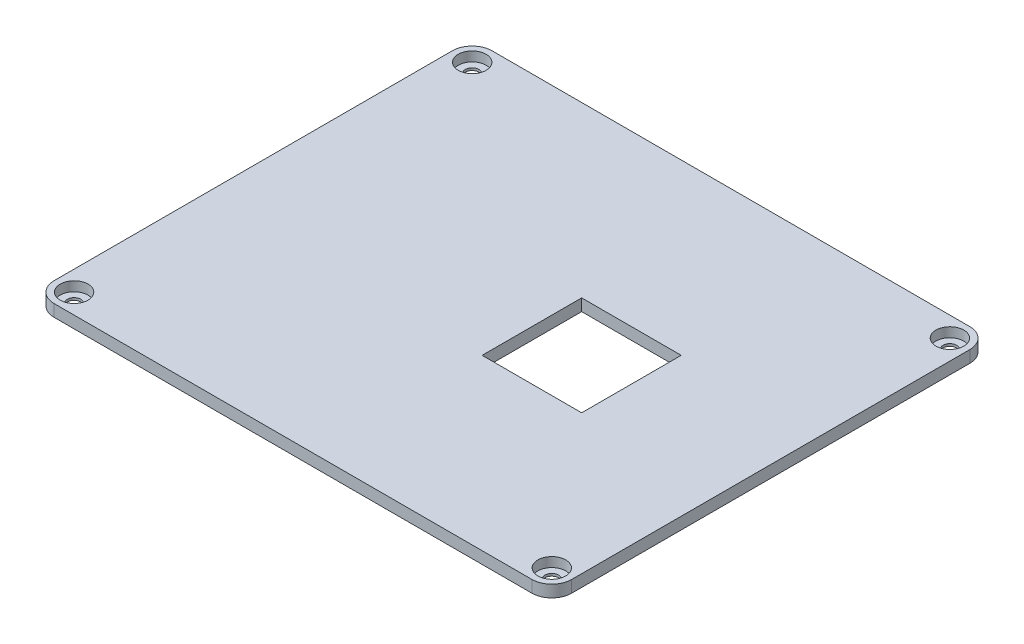
ISO-10303-21;
HEADER;
FILE_DESCRIPTION(('STEP AP214'),'2;1');
FILE_NAME('part.step','',(''),(''),'','','');
FILE_SCHEMA(('AUTOMOTIVE_DESIGN { 1 0 10303 214 1 1 1 1 }'));
ENDSEC;
DATA;
#1=APPLICATION_CONTEXT('core data for automotive mechanical design processes');
#2=APPLICATION_PROTOCOL_DEFINITION('international standard','automotive_design',2000,#1);
#3=PRODUCT_CONTEXT('',#1,'mechanical');
#4=PRODUCT('Part','Part','',(#3));
#5=PRODUCT_RELATED_PRODUCT_CATEGORY('part','',(#4));
#6=PRODUCT_DEFINITION_FORMATION('','',#4);
#7=PRODUCT_DEFINITION_CONTEXT('part definition',#1,'design');
#8=PRODUCT_DEFINITION('design','',#6,#7);
#9=PRODUCT_DEFINITION_SHAPE('','',#8);
#10=(LENGTH_UNIT() NAMED_UNIT(*) SI_UNIT(.MILLI.,.METRE.));
#11=(NAMED_UNIT(*) PLANE_ANGLE_UNIT() SI_UNIT($,.RADIAN.));
#12=(NAMED_UNIT(*) SI_UNIT($,.STERADIAN.) SOLID_ANGLE_UNIT());
#13=UNCERTAINTY_MEASURE_WITH_UNIT(LENGTH_MEASURE(1.E-05),#10,'distance_accuracy_value','');
#14=(GEOMETRIC_REPRESENTATION_CONTEXT(3) GLOBAL_UNCERTAINTY_ASSIGNED_CONTEXT((#13)) GLOBAL_UNIT_ASSIGNED_CONTEXT((#10,
#11,#12)) REPRESENTATION_CONTEXT('',''));
#15=CARTESIAN_POINT('',(0.,0.,0.));
#16=DIRECTION('',(0.,0.,1.));
#17=DIRECTION('',(1.,0.,0.));
#18=AXIS2_PLACEMENT_3D('',#15,#16,#17);
#19=CARTESIAN_POINT('',(0.,3.,0.));
#20=DIRECTION('',(1.,0.,0.));
#21=DIRECTION('',(0.,0.,-1.));
#22=AXIS2_PLACEMENT_3D('',#19,#20,#21);
#23=PLANE('',#22);
#24=DIRECTION('',(0.,0.,1.));
#25=VECTOR('',#24,1.);
#26=CARTESIAN_POINT('',(0.,3.,0.));
#27=LINE('',#26,#25);
#28=CARTESIAN_POINT('',(0.,3.,-105.));
#29=VERTEX_POINT('',#28);
#30=CARTESIAN_POINT('',(0.,3.,-5.));
#31=VERTEX_POINT('',#30);
#32=EDGE_CURVE('E197',#29,#31,#27,.T.);
#33=ORIENTED_EDGE('',*,*,#32,.F.);
#34=DIRECTION('',(0.,-1.,0.));
#35=VECTOR('',#34,1.);
#36=CARTESIAN_POINT('',(0.,3.,-105.));
#37=LINE('',#36,#35);
#38=CARTESIAN_POINT('',(0.,0.,-105.));
#39=VERTEX_POINT('',#38);
#40=EDGE_CURVE('E235',#29,#39,#37,.T.);
#41=ORIENTED_EDGE('',*,*,#40,.T.);
#42=DIRECTION('',(0.,0.,1.));
#43=VECTOR('',#42,1.);
#44=CARTESIAN_POINT('',(0.,0.,0.));
#45=LINE('',#44,#43);
#46=CARTESIAN_POINT('',(0.,0.,-5.));
#47=VERTEX_POINT('',#46);
#48=EDGE_CURVE('E209',#39,#47,#45,.T.);
#49=ORIENTED_EDGE('',*,*,#48,.T.);
#50=DIRECTION('',(0.,-1.,0.));
#51=VECTOR('',#50,1.);
#52=CARTESIAN_POINT('',(0.,3.,-5.));
#53=LINE('',#52,#51);
#54=EDGE_CURVE('E233',#47,#31,#53,.F.);
#55=ORIENTED_EDGE('',*,*,#54,.T.);
#56=EDGE_LOOP('',(#33,#41,#49,#55));
#57=FACE_BOUND('',#56,.T.);
#58=ADVANCED_FACE('F33',(#57),#23,.F.);
#59=CARTESIAN_POINT('',(0.,3.,0.));
#60=DIRECTION('',(0.,0.,-1.));
#61=DIRECTION('',(-1.,0.,0.));
#62=AXIS2_PLACEMENT_3D('',#59,#60,#61);
#63=PLANE('',#62);
#64=DIRECTION('',(1.,0.,0.));
#65=VECTOR('',#64,1.);
#66=CARTESIAN_POINT('',(0.,3.,0.));
#67=LINE('',#66,#65);
#68=CARTESIAN_POINT('',(5.,3.,0.));
#69=VERTEX_POINT('',#68);
#70=CARTESIAN_POINT('',(125.,3.,0.));
#71=VERTEX_POINT('',#70);
#72=EDGE_CURVE('E200',#69,#71,#67,.T.);
#73=ORIENTED_EDGE('',*,*,#72,.F.);
#74=DIRECTION('',(0.,-1.,0.));
#75=VECTOR('',#74,1.);
#76=CARTESIAN_POINT('',(5.,3.,0.));
#77=LINE('',#76,#75);
#78=CARTESIAN_POINT('',(5.,0.,0.));
#79=VERTEX_POINT('',#78);
#80=EDGE_CURVE('E260',#69,#79,#77,.T.);
#81=ORIENTED_EDGE('',*,*,#80,.T.);
#82=DIRECTION('',(1.,0.,0.));
#83=VECTOR('',#82,1.);
#84=CARTESIAN_POINT('',(0.,0.,0.));
#85=LINE('',#84,#83);
#86=CARTESIAN_POINT('',(125.,0.,0.));
#87=VERTEX_POINT('',#86);
#88=EDGE_CURVE('E212',#79,#87,#85,.T.);
#89=ORIENTED_EDGE('',*,*,#88,.T.);
#90=DIRECTION('',(0.,-1.,0.));
#91=VECTOR('',#90,1.);
#92=CARTESIAN_POINT('',(125.,3.,0.));
#93=LINE('',#92,#91);
#94=EDGE_CURVE('E258',#87,#71,#93,.F.);
#95=ORIENTED_EDGE('',*,*,#94,.T.);
#96=EDGE_LOOP('',(#73,#81,#89,#95));
#97=FACE_BOUND('',#96,.T.);
#98=ADVANCED_FACE('F293',(#97),#63,.F.);
#99=CARTESIAN_POINT('',(130.,3.,0.));
#100=DIRECTION('',(-1.,0.,0.));
#101=DIRECTION('',(0.,0.,1.));
#102=AXIS2_PLACEMENT_3D('',#99,#100,#101);
#103=PLANE('',#102);
#104=DIRECTION('',(0.,0.,-1.));
#105=VECTOR('',#104,1.);
#106=CARTESIAN_POINT('',(130.,0.,0.));
#107=LINE('',#106,#105);
#108=CARTESIAN_POINT('',(130.,0.,-5.));
#109=VERTEX_POINT('',#108);
#110=CARTESIAN_POINT('',(130.,0.,-105.));
#111=VERTEX_POINT('',#110);
#112=EDGE_CURVE('E215',#109,#111,#107,.T.);
#113=ORIENTED_EDGE('',*,*,#112,.T.);
#114=DIRECTION('',(0.,-1.,0.));
#115=VECTOR('',#114,1.);
#116=CARTESIAN_POINT('',(130.,3.,-105.));
#117=LINE('',#116,#115);
#118=CARTESIAN_POINT('',(130.,3.,-105.));
#119=VERTEX_POINT('',#118);
#120=EDGE_CURVE('E11',#111,#119,#117,.F.);
#121=ORIENTED_EDGE('',*,*,#120,.T.);
#122=DIRECTION('',(0.,0.,-1.));
#123=VECTOR('',#122,1.);
#124=CARTESIAN_POINT('',(130.,3.,0.));
#125=LINE('',#124,#123);
#126=CARTESIAN_POINT('',(130.,3.,-5.));
#127=VERTEX_POINT('',#126);
#128=EDGE_CURVE('E203',#127,#119,#125,.T.);
#129=ORIENTED_EDGE('',*,*,#128,.F.);
#130=DIRECTION('',(0.,-1.,0.));
#131=VECTOR('',#130,1.);
#132=CARTESIAN_POINT('',(130.,3.,-5.));
#133=LINE('',#132,#131);
#134=EDGE_CURVE('E41',#127,#109,#133,.T.);
#135=ORIENTED_EDGE('',*,*,#134,.T.);
#136=EDGE_LOOP('',(#113,#121,#129,#135));
#137=FACE_BOUND('',#136,.T.);
#138=ADVANCED_FACE('F265',(#137),#103,.F.);
#139=CARTESIAN_POINT('',(0.,3.,-110.));
#140=DIRECTION('',(0.,0.,1.));
#141=DIRECTION('',(1.,0.,0.));
#142=AXIS2_PLACEMENT_3D('',#139,#140,#141);
#143=PLANE('',#142);
#144=DIRECTION('',(-1.,0.,0.));
#145=VECTOR('',#144,1.);
#146=CARTESIAN_POINT('',(0.,0.,-110.));
#147=LINE('',#146,#145);
#148=CARTESIAN_POINT('',(125.,0.,-110.));
#149=VERTEX_POINT('',#148);
#150=CARTESIAN_POINT('',(5.,0.,-110.));
#151=VERTEX_POINT('',#150);
#152=EDGE_CURVE('E201',#149,#151,#147,.T.);
#153=ORIENTED_EDGE('',*,*,#152,.T.);
#154=DIRECTION('',(0.,-1.,0.));
#155=VECTOR('',#154,1.);
#156=CARTESIAN_POINT('',(5.,3.,-110.));
#157=LINE('',#156,#155);
#158=CARTESIAN_POINT('',(5.,3.,-110.));
#159=VERTEX_POINT('',#158);
#160=EDGE_CURVE('E249',#151,#159,#157,.F.);
#161=ORIENTED_EDGE('',*,*,#160,.T.);
#162=DIRECTION('',(-1.,0.,0.));
#163=VECTOR('',#162,1.);
#164=CARTESIAN_POINT('',(0.,3.,-110.));
#165=LINE('',#164,#163);
#166=CARTESIAN_POINT('',(125.,3.,-110.));
#167=VERTEX_POINT('',#166);
#168=EDGE_CURVE('E205',#167,#159,#165,.T.);
#169=ORIENTED_EDGE('',*,*,#168,.F.);
#170=DIRECTION('',(0.,-1.,0.));
#171=VECTOR('',#170,1.);
#172=CARTESIAN_POINT('',(125.,3.,-110.));
#173=LINE('',#172,#171);
#174=EDGE_CURVE('E246',#167,#149,#173,.T.);
#175=ORIENTED_EDGE('',*,*,#174,.T.);
#176=EDGE_LOOP('',(#153,#161,#169,#175));
#177=FACE_BOUND('',#176,.T.);
#178=ADVANCED_FACE('F278',(#177),#143,.F.);
#179=CARTESIAN_POINT('',(0.,3.,0.));
#180=DIRECTION('',(0.,-1.,0.));
#181=DIRECTION('',(0.,0.,-1.));
#182=AXIS2_PLACEMENT_3D('',#179,#180,#181);
#183=PLANE('',#182);
#184=DIRECTION('',(-1.,0.,0.));
#185=VECTOR('',#184,1.);
#186=CARTESIAN_POINT('',(95.,3.,-67.5));
#187=LINE('',#186,#185);
#188=CARTESIAN_POINT('',(95.,3.,-67.5));
#189=VERTEX_POINT('',#188);
#190=CARTESIAN_POINT('',(70.,3.,-67.5));
#191=VERTEX_POINT('',#190);
#192=EDGE_CURVE('E138',#189,#191,#187,.T.);
#193=ORIENTED_EDGE('',*,*,#192,.F.);
#194=DIRECTION('',(0.,0.,-1.));
#195=VECTOR('',#194,1.);
#196=CARTESIAN_POINT('',(95.,3.,-67.5));
#197=LINE('',#196,#195);
#198=CARTESIAN_POINT('',(95.,3.,-42.5));
#199=VERTEX_POINT('',#198);
#200=EDGE_CURVE('E143',#199,#189,#197,.T.);
#201=ORIENTED_EDGE('',*,*,#200,.F.);
#202=DIRECTION('',(1.,0.,0.));
#203=VECTOR('',#202,1.);
#204=CARTESIAN_POINT('',(95.,3.,-42.5));
#205=LINE('',#204,#203);
#206=CARTESIAN_POINT('',(70.,3.,-42.5));
#207=VERTEX_POINT('',#206);
#208=EDGE_CURVE('E148',#207,#199,#205,.T.);
#209=ORIENTED_EDGE('',*,*,#208,.F.);
#210=DIRECTION('',(0.,0.,1.));
#211=VECTOR('',#210,1.);
#212=CARTESIAN_POINT('',(70.,3.,-67.5));
#213=LINE('',#212,#211);
#214=EDGE_CURVE('E127',#191,#207,#213,.T.);
#215=ORIENTED_EDGE('',*,*,#214,.F.);
#216=EDGE_LOOP('',(#193,#201,#209,#215));
#217=FACE_BOUND('',#216,.T.);
#218=CARTESIAN_POINT('',(5.,3.,-105.));
#219=DIRECTION('',(0.,1.,0.));
#220=DIRECTION('',(0.,0.,1.));
#221=AXIS2_PLACEMENT_3D('',#218,#219,#220);
#222=CIRCLE('',#221,3.5);
#223=CARTESIAN_POINT('',(5.,3.,-101.5));
#224=VERTEX_POINT('',#223);
#225=EDGE_CURVE('E155',#224,#224,#222,.T.);
#226=ORIENTED_EDGE('',*,*,#225,.F.);
#227=EDGE_LOOP('',(#226));
#228=FACE_BOUND('',#227,.T.);
#229=CARTESIAN_POINT('',(125.,3.,-105.));
#230=DIRECTION('',(0.,1.,0.));
#231=DIRECTION('',(0.,0.,1.));
#232=AXIS2_PLACEMENT_3D('',#229,#230,#231);
#233=CIRCLE('',#232,3.5);
#234=CARTESIAN_POINT('',(125.,3.,-101.5));
#235=VERTEX_POINT('',#234);
#236=EDGE_CURVE('E167',#235,#235,#233,.T.);
#237=ORIENTED_EDGE('',*,*,#236,.F.);
#238=EDGE_LOOP('',(#237));
#239=FACE_BOUND('',#238,.T.);
#240=CARTESIAN_POINT('',(125.,3.,-5.));
#241=DIRECTION('',(0.,1.,0.));
#242=DIRECTION('',(0.,0.,1.));
#243=AXIS2_PLACEMENT_3D('',#240,#241,#242);
#244=CIRCLE('',#243,3.5);
#245=CARTESIAN_POINT('',(125.,3.,-1.5));
#246=VERTEX_POINT('',#245);
#247=EDGE_CURVE('E177',#246,#246,#244,.T.);
#248=ORIENTED_EDGE('',*,*,#247,.F.);
#249=EDGE_LOOP('',(#248));
#250=FACE_BOUND('',#249,.T.);
#251=CARTESIAN_POINT('',(5.,3.,-5.));
#252=DIRECTION('',(0.,1.,0.));
#253=DIRECTION('',(0.,0.,1.));
#254=AXIS2_PLACEMENT_3D('',#251,#252,#253);
#255=CIRCLE('',#254,3.5);
#256=CARTESIAN_POINT('',(5.,3.,-1.5));
#257=VERTEX_POINT('',#256);
#258=EDGE_CURVE('E187',#257,#257,#255,.T.);
#259=ORIENTED_EDGE('',*,*,#258,.F.);
#260=EDGE_LOOP('',(#259));
#261=FACE_BOUND('',#260,.T.);
#262=ORIENTED_EDGE('',*,*,#168,.T.);
#263=CARTESIAN_POINT('',(5.,3.,-105.));
#264=DIRECTION('',(0.,-1.,0.));
#265=DIRECTION('',(0.,0.,-1.));
#266=AXIS2_PLACEMENT_3D('',#263,#264,#265);
#267=CIRCLE('',#266,5.);
#268=EDGE_CURVE('E256',#159,#29,#267,.F.);
#269=ORIENTED_EDGE('',*,*,#268,.T.);
#270=ORIENTED_EDGE('',*,*,#32,.T.);
#271=CARTESIAN_POINT('',(5.,3.,-5.));
#272=DIRECTION('',(0.,-1.,0.));
#273=DIRECTION('',(0.,0.,-1.));
#274=AXIS2_PLACEMENT_3D('',#271,#272,#273);
#275=CIRCLE('',#274,5.);
#276=EDGE_CURVE('E254',#31,#69,#275,.F.);
#277=ORIENTED_EDGE('',*,*,#276,.T.);
#278=ORIENTED_EDGE('',*,*,#72,.T.);
#279=CARTESIAN_POINT('',(125.,3.,-5.));
#280=DIRECTION('',(0.,-1.,0.));
#281=DIRECTION('',(0.,0.,-1.));
#282=AXIS2_PLACEMENT_3D('',#279,#280,#281);
#283=CIRCLE('',#282,5.);
#284=EDGE_CURVE('E53',#71,#127,#283,.F.);
#285=ORIENTED_EDGE('',*,*,#284,.T.);
#286=ORIENTED_EDGE('',*,*,#128,.T.);
#287=CARTESIAN_POINT('',(125.,3.,-105.));
#288=DIRECTION('',(0.,-1.,0.));
#289=DIRECTION('',(0.,0.,-1.));
#290=AXIS2_PLACEMENT_3D('',#287,#288,#289);
#291=CIRCLE('',#290,5.);
#292=EDGE_CURVE('E252',#119,#167,#291,.F.);
#293=ORIENTED_EDGE('',*,*,#292,.T.);
#294=EDGE_LOOP('',(#262,#269,#270,#277,#278,#285,#286,#293));
#295=FACE_BOUND('',#294,.T.);
#296=ADVANCED_FACE('F145',(#217,#228,#239,#250,#261,#295),#183,.F.);
#297=CARTESIAN_POINT('',(0.,0.,0.));
#298=DIRECTION('',(0.,-1.,0.));
#299=DIRECTION('',(0.,0.,-1.));
#300=AXIS2_PLACEMENT_3D('',#297,#298,#299);
#301=PLANE('',#300);
#302=DIRECTION('',(0.,0.,1.));
#303=VECTOR('',#302,1.);
#304=CARTESIAN_POINT('',(95.,0.,0.));
#305=LINE('',#304,#303);
#306=CARTESIAN_POINT('',(95.,0.,-67.5));
#307=VERTEX_POINT('',#306);
#308=CARTESIAN_POINT('',(95.,0.,-42.5));
#309=VERTEX_POINT('',#308);
#310=EDGE_CURVE('E231',#307,#309,#305,.T.);
#311=ORIENTED_EDGE('',*,*,#310,.F.);
#312=DIRECTION('',(1.,0.,0.));
#313=VECTOR('',#312,1.);
#314=CARTESIAN_POINT('',(0.,0.,-67.5));
#315=LINE('',#314,#313);
#316=CARTESIAN_POINT('',(70.,0.,-67.5));
#317=VERTEX_POINT('',#316);
#318=EDGE_CURVE('E208',#317,#307,#315,.T.);
#319=ORIENTED_EDGE('',*,*,#318,.F.);
#320=DIRECTION('',(0.,0.,-1.));
#321=VECTOR('',#320,1.);
#322=CARTESIAN_POINT('',(70.,0.,0.));
#323=LINE('',#322,#321);
#324=CARTESIAN_POINT('',(70.,0.,-42.5));
#325=VERTEX_POINT('',#324);
#326=EDGE_CURVE('E130',#325,#317,#323,.T.);
#327=ORIENTED_EDGE('',*,*,#326,.F.);
#328=DIRECTION('',(-1.,0.,0.));
#329=VECTOR('',#328,1.);
#330=CARTESIAN_POINT('',(0.,0.,-42.5));
#331=LINE('',#330,#329);
#332=EDGE_CURVE('E229',#309,#325,#331,.T.);
#333=ORIENTED_EDGE('',*,*,#332,.F.);
#334=EDGE_LOOP('',(#311,#319,#327,#333));
#335=FACE_BOUND('',#334,.T.);
#336=CARTESIAN_POINT('',(5.,0.,-105.));
#337=DIRECTION('',(0.,-1.,0.));
#338=DIRECTION('',(0.,0.,-1.));
#339=AXIS2_PLACEMENT_3D('',#336,#337,#338);
#340=CIRCLE('',#339,1.7);
#341=CARTESIAN_POINT('',(5.,0.,-106.7));
#342=VERTEX_POINT('',#341);
#343=EDGE_CURVE('E166',#342,#342,#340,.T.);
#344=ORIENTED_EDGE('',*,*,#343,.F.);
#345=EDGE_LOOP('',(#344));
#346=FACE_BOUND('',#345,.T.);
#347=CARTESIAN_POINT('',(125.,0.,-105.));
#348=DIRECTION('',(0.,-1.,0.));
#349=DIRECTION('',(0.,0.,-1.));
#350=AXIS2_PLACEMENT_3D('',#347,#348,#349);
#351=CIRCLE('',#350,1.70000000000001);
#352=CARTESIAN_POINT('',(125.,0.,-106.7));
#353=VERTEX_POINT('',#352);
#354=EDGE_CURVE('E176',#353,#353,#351,.T.);
#355=ORIENTED_EDGE('',*,*,#354,.F.);
#356=EDGE_LOOP('',(#355));
#357=FACE_BOUND('',#356,.T.);
#358=CARTESIAN_POINT('',(125.,0.,-5.));
#359=DIRECTION('',(0.,-1.,0.));
#360=DIRECTION('',(0.,0.,-1.));
#361=AXIS2_PLACEMENT_3D('',#358,#359,#360);
#362=CIRCLE('',#361,1.70000000000001);
#363=CARTESIAN_POINT('',(125.,0.,-6.70000000000001));
#364=VERTEX_POINT('',#363);
#365=EDGE_CURVE('E186',#364,#364,#362,.T.);
#366=ORIENTED_EDGE('',*,*,#365,.F.);
#367=EDGE_LOOP('',(#366));
#368=FACE_BOUND('',#367,.T.);
#369=CARTESIAN_POINT('',(5.,0.,-5.));
#370=DIRECTION('',(0.,-1.,0.));
#371=DIRECTION('',(0.,0.,-1.));
#372=AXIS2_PLACEMENT_3D('',#369,#370,#371);
#373=CIRCLE('',#372,1.7);
#374=CARTESIAN_POINT('',(5.,0.,-6.7));
#375=VERTEX_POINT('',#374);
#376=EDGE_CURVE('E196',#375,#375,#373,.T.);
#377=ORIENTED_EDGE('',*,*,#376,.F.);
#378=EDGE_LOOP('',(#377));
#379=FACE_BOUND('',#378,.T.);
#380=ORIENTED_EDGE('',*,*,#48,.F.);
#381=CARTESIAN_POINT('',(5.,0.,-105.));
#382=DIRECTION('',(0.,-1.,0.));
#383=DIRECTION('',(0.,0.,-1.));
#384=AXIS2_PLACEMENT_3D('',#381,#382,#383);
#385=CIRCLE('',#384,5.);
#386=EDGE_CURVE('E244',#39,#151,#385,.T.);
#387=ORIENTED_EDGE('',*,*,#386,.T.);
#388=ORIENTED_EDGE('',*,*,#152,.F.);
#389=CARTESIAN_POINT('',(125.,0.,-105.));
#390=DIRECTION('',(0.,-1.,0.));
#391=DIRECTION('',(0.,0.,-1.));
#392=AXIS2_PLACEMENT_3D('',#389,#390,#391);
#393=CIRCLE('',#392,5.);
#394=EDGE_CURVE('E240',#149,#111,#393,.T.);
#395=ORIENTED_EDGE('',*,*,#394,.T.);
#396=ORIENTED_EDGE('',*,*,#112,.F.);
#397=CARTESIAN_POINT('',(125.,0.,-5.));
#398=DIRECTION('',(0.,-1.,0.));
#399=DIRECTION('',(0.,0.,-1.));
#400=AXIS2_PLACEMENT_3D('',#397,#398,#399);
#401=CIRCLE('',#400,5.);
#402=EDGE_CURVE('E238',#109,#87,#401,.T.);
#403=ORIENTED_EDGE('',*,*,#402,.T.);
#404=ORIENTED_EDGE('',*,*,#88,.F.);
#405=CARTESIAN_POINT('',(5.,0.,-5.));
#406=DIRECTION('',(0.,-1.,0.));
#407=DIRECTION('',(0.,0.,-1.));
#408=AXIS2_PLACEMENT_3D('',#405,#406,#407);
#409=CIRCLE('',#408,5.);
#410=EDGE_CURVE('E242',#79,#47,#409,.T.);
#411=ORIENTED_EDGE('',*,*,#410,.T.);
#412=EDGE_LOOP('',(#380,#387,#388,#395,#396,#403,#404,#411));
#413=FACE_BOUND('',#412,.T.);
#414=ADVANCED_FACE('F269',(#335,#346,#357,#368,#379,#413),#301,.T.);
#415=CARTESIAN_POINT('',(5.,3.,-5.));
#416=DIRECTION('',(0.,1.,0.));
#417=DIRECTION('',(0.,0.,1.));
#418=AXIS2_PLACEMENT_3D('',#415,#416,#417);
#419=CYLINDRICAL_SURFACE('',#418,1.7);
#420=ORIENTED_EDGE('',*,*,#376,.T.);
#421=EDGE_LOOP('',(#420));
#422=FACE_BOUND('',#421,.T.);
#423=CARTESIAN_POINT('',(5.,0.600000000000001,-5.));
#424=DIRECTION('',(0.,1.,0.));
#425=DIRECTION('',(0.,0.,1.));
#426=AXIS2_PLACEMENT_3D('',#423,#424,#425);
#427=CIRCLE('',#426,1.7);
#428=CARTESIAN_POINT('',(5.,0.600000000000001,-3.3));
#429=VERTEX_POINT('',#428);
#430=EDGE_CURVE('E193',#429,#429,#427,.T.);
#431=ORIENTED_EDGE('',*,*,#430,.T.);
#432=EDGE_LOOP('',(#431));
#433=FACE_BOUND('',#432,.T.);
#434=ADVANCED_FACE('F462',(#422,#433),#419,.F.);
#435=CARTESIAN_POINT('',(6.7,0.600000000000001,-5.));
#436=DIRECTION('',(0.,-1.,0.));
#437=DIRECTION('',(0.,0.,-1.));
#438=AXIS2_PLACEMENT_3D('',#435,#436,#437);
#439=PLANE('',#438);
#440=ORIENTED_EDGE('',*,*,#430,.F.);
#441=EDGE_LOOP('',(#440));
#442=FACE_BOUND('',#441,.T.);
#443=CARTESIAN_POINT('',(5.,0.600000000000001,-5.));
#444=DIRECTION('',(0.,1.,0.));
#445=DIRECTION('',(0.,0.,1.));
#446=AXIS2_PLACEMENT_3D('',#443,#444,#445);
#447=CIRCLE('',#446,3.5);
#448=CARTESIAN_POINT('',(5.,0.600000000000001,-1.5));
#449=VERTEX_POINT('',#448);
#450=EDGE_CURVE('E190',#449,#449,#447,.T.);
#451=ORIENTED_EDGE('',*,*,#450,.T.);
#452=EDGE_LOOP('',(#451));
#453=FACE_BOUND('',#452,.T.);
#454=ADVANCED_FACE('F453',(#442,#453),#439,.F.);
#455=CARTESIAN_POINT('',(5.,3.,-5.));
#456=DIRECTION('',(0.,1.,0.));
#457=DIRECTION('',(0.,0.,1.));
#458=AXIS2_PLACEMENT_3D('',#455,#456,#457);
#459=CYLINDRICAL_SURFACE('',#458,3.5);
#460=ORIENTED_EDGE('',*,*,#450,.F.);
#461=EDGE_LOOP('',(#460));
#462=FACE_BOUND('',#461,.T.);
#463=ORIENTED_EDGE('',*,*,#258,.T.);
#464=EDGE_LOOP('',(#463));
#465=FACE_BOUND('',#464,.T.);
#466=ADVANCED_FACE('F444',(#462,#465),#459,.F.);
#467=CARTESIAN_POINT('',(125.,3.,-5.));
#468=DIRECTION('',(0.,1.,0.));
#469=DIRECTION('',(0.,0.,1.));
#470=AXIS2_PLACEMENT_3D('',#467,#468,#469);
#471=CYLINDRICAL_SURFACE('',#470,1.70000000000001);
#472=ORIENTED_EDGE('',*,*,#365,.T.);
#473=EDGE_LOOP('',(#472));
#474=FACE_BOUND('',#473,.T.);
#475=CARTESIAN_POINT('',(125.,0.600000000000001,-5.));
#476=DIRECTION('',(0.,1.,0.));
#477=DIRECTION('',(0.,0.,1.));
#478=AXIS2_PLACEMENT_3D('',#475,#476,#477);
#479=CIRCLE('',#478,1.70000000000001);
#480=CARTESIAN_POINT('',(125.,0.600000000000001,-3.29999999999999));
#481=VERTEX_POINT('',#480);
#482=EDGE_CURVE('E183',#481,#481,#479,.T.);
#483=ORIENTED_EDGE('',*,*,#482,.T.);
#484=EDGE_LOOP('',(#483));
#485=FACE_BOUND('',#484,.T.);
#486=ADVANCED_FACE('F435',(#474,#485),#471,.F.);
#487=CARTESIAN_POINT('',(126.7,0.600000000000001,-5.));
#488=DIRECTION('',(0.,-1.,0.));
#489=DIRECTION('',(0.,0.,-1.));
#490=AXIS2_PLACEMENT_3D('',#487,#488,#489);
#491=PLANE('',#490);
#492=ORIENTED_EDGE('',*,*,#482,.F.);
#493=EDGE_LOOP('',(#492));
#494=FACE_BOUND('',#493,.T.);
#495=CARTESIAN_POINT('',(125.,0.600000000000001,-5.));
#496=DIRECTION('',(0.,1.,0.));
#497=DIRECTION('',(0.,0.,1.));
#498=AXIS2_PLACEMENT_3D('',#495,#496,#497);
#499=CIRCLE('',#498,3.5);
#500=CARTESIAN_POINT('',(125.,0.600000000000001,-1.5));
#501=VERTEX_POINT('',#500);
#502=EDGE_CURVE('E180',#501,#501,#499,.T.);
#503=ORIENTED_EDGE('',*,*,#502,.T.);
#504=EDGE_LOOP('',(#503));
#505=FACE_BOUND('',#504,.T.);
#506=ADVANCED_FACE('F426',(#494,#505),#491,.F.);
#507=CARTESIAN_POINT('',(125.,3.,-5.));
#508=DIRECTION('',(0.,1.,0.));
#509=DIRECTION('',(0.,0.,1.));
#510=AXIS2_PLACEMENT_3D('',#507,#508,#509);
#511=CYLINDRICAL_SURFACE('',#510,3.5);
#512=ORIENTED_EDGE('',*,*,#502,.F.);
#513=EDGE_LOOP('',(#512));
#514=FACE_BOUND('',#513,.T.);
#515=ORIENTED_EDGE('',*,*,#247,.T.);
#516=EDGE_LOOP('',(#515));
#517=FACE_BOUND('',#516,.T.);
#518=ADVANCED_FACE('F417',(#514,#517),#511,.F.);
#519=CARTESIAN_POINT('',(125.,3.,-105.));
#520=DIRECTION('',(0.,1.,0.));
#521=DIRECTION('',(0.,0.,1.));
#522=AXIS2_PLACEMENT_3D('',#519,#520,#521);
#523=CYLINDRICAL_SURFACE('',#522,1.70000000000001);
#524=ORIENTED_EDGE('',*,*,#354,.T.);
#525=EDGE_LOOP('',(#524));
#526=FACE_BOUND('',#525,.T.);
#527=CARTESIAN_POINT('',(125.,0.600000000000001,-105.));
#528=DIRECTION('',(0.,1.,0.));
#529=DIRECTION('',(0.,0.,1.));
#530=AXIS2_PLACEMENT_3D('',#527,#528,#529);
#531=CIRCLE('',#530,1.70000000000001);
#532=CARTESIAN_POINT('',(125.,0.600000000000001,-103.3));
#533=VERTEX_POINT('',#532);
#534=EDGE_CURVE('E173',#533,#533,#531,.T.);
#535=ORIENTED_EDGE('',*,*,#534,.T.);
#536=EDGE_LOOP('',(#535));
#537=FACE_BOUND('',#536,.T.);
#538=ADVANCED_FACE('F408',(#526,#537),#523,.F.);
#539=CARTESIAN_POINT('',(126.7,0.600000000000001,-105.));
#540=DIRECTION('',(0.,-1.,0.));
#541=DIRECTION('',(0.,0.,-1.));
#542=AXIS2_PLACEMENT_3D('',#539,#540,#541);
#543=PLANE('',#542);
#544=ORIENTED_EDGE('',*,*,#534,.F.);
#545=EDGE_LOOP('',(#544));
#546=FACE_BOUND('',#545,.T.);
#547=CARTESIAN_POINT('',(125.,0.600000000000001,-105.));
#548=DIRECTION('',(0.,1.,0.));
#549=DIRECTION('',(0.,0.,1.));
#550=AXIS2_PLACEMENT_3D('',#547,#548,#549);
#551=CIRCLE('',#550,3.5);
#552=CARTESIAN_POINT('',(125.,0.600000000000001,-101.5));
#553=VERTEX_POINT('',#552);
#554=EDGE_CURVE('E170',#553,#553,#551,.T.);
#555=ORIENTED_EDGE('',*,*,#554,.T.);
#556=EDGE_LOOP('',(#555));
#557=FACE_BOUND('',#556,.T.);
#558=ADVANCED_FACE('F399',(#546,#557),#543,.F.);
#559=CARTESIAN_POINT('',(125.,3.,-105.));
#560=DIRECTION('',(0.,1.,0.));
#561=DIRECTION('',(0.,0.,1.));
#562=AXIS2_PLACEMENT_3D('',#559,#560,#561);
#563=CYLINDRICAL_SURFACE('',#562,3.5);
#564=ORIENTED_EDGE('',*,*,#554,.F.);
#565=EDGE_LOOP('',(#564));
#566=FACE_BOUND('',#565,.T.);
#567=ORIENTED_EDGE('',*,*,#236,.T.);
#568=EDGE_LOOP('',(#567));
#569=FACE_BOUND('',#568,.T.);
#570=ADVANCED_FACE('F390',(#566,#569),#563,.F.);
#571=CARTESIAN_POINT('',(5.,3.,-105.));
#572=DIRECTION('',(0.,1.,0.));
#573=DIRECTION('',(0.,0.,1.));
#574=AXIS2_PLACEMENT_3D('',#571,#572,#573);
#575=CYLINDRICAL_SURFACE('',#574,1.7);
#576=ORIENTED_EDGE('',*,*,#343,.T.);
#577=EDGE_LOOP('',(#576));
#578=FACE_BOUND('',#577,.T.);
#579=CARTESIAN_POINT('',(5.,0.600000000000001,-105.));
#580=DIRECTION('',(0.,1.,0.));
#581=DIRECTION('',(0.,0.,1.));
#582=AXIS2_PLACEMENT_3D('',#579,#580,#581);
#583=CIRCLE('',#582,1.7);
#584=CARTESIAN_POINT('',(5.,0.600000000000001,-103.3));
#585=VERTEX_POINT('',#584);
#586=EDGE_CURVE('E163',#585,#585,#583,.T.);
#587=ORIENTED_EDGE('',*,*,#586,.T.);
#588=EDGE_LOOP('',(#587));
#589=FACE_BOUND('',#588,.T.);
#590=ADVANCED_FACE('F381',(#578,#589),#575,.F.);
#591=CARTESIAN_POINT('',(6.7,0.600000000000001,-105.));
#592=DIRECTION('',(0.,-1.,0.));
#593=DIRECTION('',(0.,0.,-1.));
#594=AXIS2_PLACEMENT_3D('',#591,#592,#593);
#595=PLANE('',#594);
#596=ORIENTED_EDGE('',*,*,#586,.F.);
#597=EDGE_LOOP('',(#596));
#598=FACE_BOUND('',#597,.T.);
#599=CARTESIAN_POINT('',(5.,0.600000000000001,-105.));
#600=DIRECTION('',(0.,1.,0.));
#601=DIRECTION('',(0.,0.,1.));
#602=AXIS2_PLACEMENT_3D('',#599,#600,#601);
#603=CIRCLE('',#602,3.5);
#604=CARTESIAN_POINT('',(5.,0.600000000000001,-101.5));
#605=VERTEX_POINT('',#604);
#606=EDGE_CURVE('E160',#605,#605,#603,.T.);
#607=ORIENTED_EDGE('',*,*,#606,.T.);
#608=EDGE_LOOP('',(#607));
#609=FACE_BOUND('',#608,.T.);
#610=ADVANCED_FACE('F372',(#598,#609),#595,.F.);
#611=CARTESIAN_POINT('',(5.,3.,-105.));
#612=DIRECTION('',(0.,1.,0.));
#613=DIRECTION('',(0.,0.,1.));
#614=AXIS2_PLACEMENT_3D('',#611,#612,#613);
#615=CYLINDRICAL_SURFACE('',#614,3.5);
#616=ORIENTED_EDGE('',*,*,#606,.F.);
#617=EDGE_LOOP('',(#616));
#618=FACE_BOUND('',#617,.T.);
#619=ORIENTED_EDGE('',*,*,#225,.T.);
#620=EDGE_LOOP('',(#619));
#621=FACE_BOUND('',#620,.T.);
#622=ADVANCED_FACE('F363',(#618,#621),#615,.F.);
#623=CARTESIAN_POINT('',(95.,-2.,-67.5));
#624=DIRECTION('',(1.,0.,0.));
#625=DIRECTION('',(0.,0.,-1.));
#626=AXIS2_PLACEMENT_3D('',#623,#624,#625);
#627=PLANE('',#626);
#628=ORIENTED_EDGE('',*,*,#310,.T.);
#629=DIRECTION('',(0.,1.,0.));
#630=VECTOR('',#629,1.);
#631=CARTESIAN_POINT('',(95.,-2.,-42.5));
#632=LINE('',#631,#630);
#633=EDGE_CURVE('E153',#309,#199,#632,.T.);
#634=ORIENTED_EDGE('',*,*,#633,.T.);
#635=ORIENTED_EDGE('',*,*,#200,.T.);
#636=DIRECTION('',(0.,1.,0.));
#637=VECTOR('',#636,1.);
#638=CARTESIAN_POINT('',(95.,-2.,-67.5));
#639=LINE('',#638,#637);
#640=EDGE_CURVE('E134',#307,#189,#639,.T.);
#641=ORIENTED_EDGE('',*,*,#640,.F.);
#642=EDGE_LOOP('',(#628,#634,#635,#641));
#643=FACE_BOUND('',#642,.T.);
#644=ADVANCED_FACE('F354',(#643),#627,.F.);
#645=CARTESIAN_POINT('',(95.,-2.,-42.5));
#646=DIRECTION('',(0.,0.,1.));
#647=DIRECTION('',(1.,0.,0.));
#648=AXIS2_PLACEMENT_3D('',#645,#646,#647);
#649=PLANE('',#648);
#650=ORIENTED_EDGE('',*,*,#332,.T.);
#651=DIRECTION('',(0.,1.,0.));
#652=VECTOR('',#651,1.);
#653=CARTESIAN_POINT('',(70.,-2.,-42.5));
#654=LINE('',#653,#652);
#655=EDGE_CURVE('E133',#325,#207,#654,.T.);
#656=ORIENTED_EDGE('',*,*,#655,.T.);
#657=ORIENTED_EDGE('',*,*,#208,.T.);
#658=ORIENTED_EDGE('',*,*,#633,.F.);
#659=EDGE_LOOP('',(#650,#656,#657,#658));
#660=FACE_BOUND('',#659,.T.);
#661=ADVANCED_FACE('F346',(#660),#649,.F.);
#662=CARTESIAN_POINT('',(70.,-2.,-67.5));
#663=DIRECTION('',(-1.,0.,0.));
#664=DIRECTION('',(0.,0.,1.));
#665=AXIS2_PLACEMENT_3D('',#662,#663,#664);
#666=PLANE('',#665);
#667=ORIENTED_EDGE('',*,*,#326,.T.);
#668=DIRECTION('',(0.,1.,0.));
#669=VECTOR('',#668,1.);
#670=CARTESIAN_POINT('',(70.,-2.,-67.5));
#671=LINE('',#670,#669);
#672=EDGE_CURVE('E122',#317,#191,#671,.T.);
#673=ORIENTED_EDGE('',*,*,#672,.T.);
#674=ORIENTED_EDGE('',*,*,#214,.T.);
#675=ORIENTED_EDGE('',*,*,#655,.F.);
#676=EDGE_LOOP('',(#667,#673,#674,#675));
#677=FACE_BOUND('',#676,.T.);
#678=ADVANCED_FACE('F124',(#677),#666,.F.);
#679=CARTESIAN_POINT('',(95.,-2.,-67.5));
#680=DIRECTION('',(0.,0.,-1.));
#681=DIRECTION('',(-1.,0.,0.));
#682=AXIS2_PLACEMENT_3D('',#679,#680,#681);
#683=PLANE('',#682);
#684=ORIENTED_EDGE('',*,*,#318,.T.);
#685=ORIENTED_EDGE('',*,*,#640,.T.);
#686=ORIENTED_EDGE('',*,*,#192,.T.);
#687=ORIENTED_EDGE('',*,*,#672,.F.);
#688=EDGE_LOOP('',(#684,#685,#686,#687));
#689=FACE_BOUND('',#688,.T.);
#690=ADVANCED_FACE('F139',(#689),#683,.F.);
#691=CARTESIAN_POINT('',(5.,3.,-105.));
#692=DIRECTION('',(0.,-1.,0.));
#693=DIRECTION('',(0.,0.,-1.));
#694=AXIS2_PLACEMENT_3D('',#691,#692,#693);
#695=CYLINDRICAL_SURFACE('',#694,5.);
#696=ORIENTED_EDGE('',*,*,#268,.F.);
#697=ORIENTED_EDGE('',*,*,#160,.F.);
#698=ORIENTED_EDGE('',*,*,#386,.F.);
#699=ORIENTED_EDGE('',*,*,#40,.F.);
#700=EDGE_LOOP('',(#696,#697,#698,#699));
#701=FACE_BOUND('',#700,.T.);
#702=ADVANCED_FACE('F284',(#701),#695,.T.);
#703=CARTESIAN_POINT('',(5.,3.,-5.));
#704=DIRECTION('',(0.,-1.,0.));
#705=DIRECTION('',(0.,0.,-1.));
#706=AXIS2_PLACEMENT_3D('',#703,#704,#705);
#707=CYLINDRICAL_SURFACE('',#706,5.);
#708=ORIENTED_EDGE('',*,*,#276,.F.);
#709=ORIENTED_EDGE('',*,*,#54,.F.);
#710=ORIENTED_EDGE('',*,*,#410,.F.);
#711=ORIENTED_EDGE('',*,*,#80,.F.);
#712=EDGE_LOOP('',(#708,#709,#710,#711));
#713=FACE_BOUND('',#712,.T.);
#714=ADVANCED_FACE('F290',(#713),#707,.T.);
#715=CARTESIAN_POINT('',(125.,3.,-105.));
#716=DIRECTION('',(0.,-1.,0.));
#717=DIRECTION('',(0.,0.,-1.));
#718=AXIS2_PLACEMENT_3D('',#715,#716,#717);
#719=CYLINDRICAL_SURFACE('',#718,5.);
#720=ORIENTED_EDGE('',*,*,#292,.F.);
#721=ORIENTED_EDGE('',*,*,#120,.F.);
#722=ORIENTED_EDGE('',*,*,#394,.F.);
#723=ORIENTED_EDGE('',*,*,#174,.F.);
#724=EDGE_LOOP('',(#720,#721,#722,#723));
#725=FACE_BOUND('',#724,.T.);
#726=ADVANCED_FACE('F275',(#725),#719,.T.);
#727=CARTESIAN_POINT('',(125.,3.,-5.));
#728=DIRECTION('',(0.,-1.,0.));
#729=DIRECTION('',(0.,0.,-1.));
#730=AXIS2_PLACEMENT_3D('',#727,#728,#729);
#731=CYLINDRICAL_SURFACE('',#730,5.);
#732=ORIENTED_EDGE('',*,*,#284,.F.);
#733=ORIENTED_EDGE('',*,*,#94,.F.);
#734=ORIENTED_EDGE('',*,*,#402,.F.);
#735=ORIENTED_EDGE('',*,*,#134,.F.);
#736=EDGE_LOOP('',(#732,#733,#734,#735));
#737=FACE_BOUND('',#736,.T.);
#738=ADVANCED_FACE('F35',(#737),#731,.T.);
#739=CLOSED_SHELL('',(#58,#98,#138,#178,#296,#414,#434,#454,#466,#486,#506,#518,#538,#558,#570,
#590,#610,#622,#644,#661,#678,#690,#702,#714,#726,#738));
#740=MANIFOLD_SOLID_BREP('B2',#739);
#741=ADVANCED_BREP_SHAPE_REPRESENTATION('',(#18,#740),#14);
#742=SHAPE_DEFINITION_REPRESENTATION(#9,#741);
ENDSEC;
END-ISO-10303-21;
